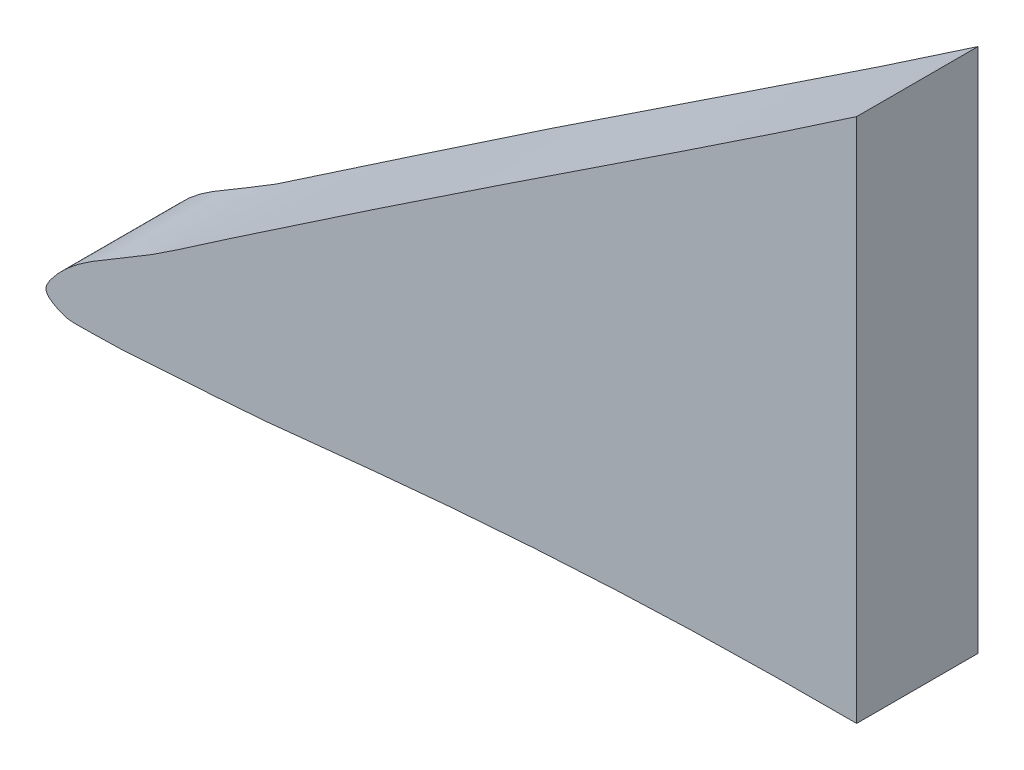
ISO-10303-21;
HEADER;
FILE_DESCRIPTION(('STEP AP214'),'2;1');
FILE_NAME('part.step','',(''),(''),'','','');
FILE_SCHEMA(('AUTOMOTIVE_DESIGN { 1 0 10303 214 1 1 1 1 }'));
ENDSEC;
DATA;
#1=APPLICATION_CONTEXT('core data for automotive mechanical design processes');
#2=APPLICATION_PROTOCOL_DEFINITION('international standard','automotive_design',2000,#1);
#3=PRODUCT_CONTEXT('',#1,'mechanical');
#4=PRODUCT('Part','Part','',(#3));
#5=PRODUCT_RELATED_PRODUCT_CATEGORY('part','',(#4));
#6=PRODUCT_DEFINITION_FORMATION('','',#4);
#7=PRODUCT_DEFINITION_CONTEXT('part definition',#1,'design');
#8=PRODUCT_DEFINITION('design','',#6,#7);
#9=PRODUCT_DEFINITION_SHAPE('','',#8);
#10=(LENGTH_UNIT() NAMED_UNIT(*) SI_UNIT(.MILLI.,.METRE.));
#11=(NAMED_UNIT(*) PLANE_ANGLE_UNIT() SI_UNIT($,.RADIAN.));
#12=(NAMED_UNIT(*) SI_UNIT($,.STERADIAN.) SOLID_ANGLE_UNIT());
#13=UNCERTAINTY_MEASURE_WITH_UNIT(LENGTH_MEASURE(1.E-05),#10,'distance_accuracy_value','');
#14=(GEOMETRIC_REPRESENTATION_CONTEXT(3) GLOBAL_UNCERTAINTY_ASSIGNED_CONTEXT((#13)) GLOBAL_UNIT_ASSIGNED_CONTEXT((#10,
#11,#12)) REPRESENTATION_CONTEXT('',''));
#15=CARTESIAN_POINT('',(0.,0.,0.));
#16=DIRECTION('',(0.,0.,1.));
#17=DIRECTION('',(1.,0.,0.));
#18=AXIS2_PLACEMENT_3D('',#15,#16,#17);
#19=CARTESIAN_POINT('',(-46.714549636511,-86.6609953526798,75.9999999999997));
#20=CARTESIAN_POINT('',(-50.8091947260203,-89.4689143421339,75.9999999999997));
#21=CARTESIAN_POINT('',(-54.9397706813966,-92.2232574132769,75.9999999999997));
#22=CARTESIAN_POINT('',(-63.2198688412411,-97.7036931176967,75.9999999999997));
#23=CARTESIAN_POINT('',(-67.3679142677134,-100.43194382548,75.9999999999997));
#24=CARTESIAN_POINT('',(-73.5732698081573,-104.54945828435,75.9999999999997));
#25=CARTESIAN_POINT('',(-75.6397526068602,-105.924963015026,75.9999999999997));
#26=CARTESIAN_POINT('',(-79.7613454149467,-108.692914657884,75.9999999999997));
#27=CARTESIAN_POINT('',(-81.8146719917252,-110.087996763598,75.9999999999997));
#28=CARTESIAN_POINT('',(-85.9288257974102,-112.867027581635,75.9999999999997));
#29=CARTESIAN_POINT('',(-87.9932562951251,-114.245673064379,75.9999999999997));
#30=CARTESIAN_POINT('',(-91.0597919095647,-116.358148681436,75.9999999999997));
#31=CARTESIAN_POINT('',(-92.0763182018151,-117.070756000452,75.9999999999997));
#32=CARTESIAN_POINT('',(-93.6491628880159,-118.06835023249,75.9999999999997));
#33=CARTESIAN_POINT('',(-94.180860103911,-118.388688735599,75.9999999999997));
#34=CARTESIAN_POINT('',(-95.2506720370473,-119.01881400861,75.9999999999997));
#35=CARTESIAN_POINT('',(-95.7892547549338,-119.327831286199,75.9999999999997));
#36=CARTESIAN_POINT('',(-96.8565030480349,-119.962171727113,75.9999999999997));
#37=CARTESIAN_POINT('',(-97.3865090636973,-120.288220428454,75.9999999999997));
#38=CARTESIAN_POINT('',(-98.1436738417562,-120.829915427262,75.9999999999997));
#39=CARTESIAN_POINT('',(-98.3884907583013,-121.018678751976,75.9999999999997));
#40=CARTESIAN_POINT('',(-98.8550575341822,-121.421182639813,75.9999999999997));
#41=CARTESIAN_POINT('',(-99.0767875291657,-121.634944712253,75.9999999999997));
#42=CARTESIAN_POINT('',(-99.3934502827243,-121.972839407285,75.9999999999997));
#43=CARTESIAN_POINT('',(-99.4957183570229,-122.089029277234,75.9999999999997));
#44=CARTESIAN_POINT('',(-99.6939641465856,-122.328220280304,75.9999999999997));
#45=CARTESIAN_POINT('',(-99.7910298873941,-122.45098983056,75.9999999999997));
#46=CARTESIAN_POINT('',(-99.9253083649858,-122.641798311248,75.9999999999997));
#47=CARTESIAN_POINT('',(-99.968013769193,-122.706690390935,75.9999999999997));
#48=CARTESIAN_POINT('',(-100.046569860655,-122.840776927602,75.9999999999997));
#49=CARTESIAN_POINT('',(-100.083097842919,-122.909888224136,75.9999999999997));
#50=CARTESIAN_POINT('',(-100.140122006398,-123.056744369577,75.9999999999997));
#51=CARTESIAN_POINT('',(-100.160138177325,-123.133794468132,75.9999999999997));
#52=CARTESIAN_POINT('',(-100.161987852299,-123.29092910568,75.9999999999997));
#53=CARTESIAN_POINT('',(-100.140435044257,-123.369170572449,75.9999999999997));
#54=CARTESIAN_POINT('',(-100.062395177802,-123.505420696053,75.9999999999997));
#55=CARTESIAN_POINT('',(-100.008820348166,-123.564815270248,75.9999999999997));
#56=CARTESIAN_POINT('',(-99.8922824191521,-123.671540082887,75.9999999999997));
#57=CARTESIAN_POINT('',(-99.8292266810561,-123.718228121976,75.9999999999997));
#58=CARTESIAN_POINT('',(-99.6343201626261,-123.849121581957,75.9999999999997));
#59=CARTESIAN_POINT('',(-99.4960552759929,-123.925128965519,75.9999999999997));
#60=CARTESIAN_POINT('',(-99.2139737089938,-124.060902500676,75.9999999999997));
#61=CARTESIAN_POINT('',(-99.0693868264005,-124.120309837029,75.9999999999997));
#62=CARTESIAN_POINT('',(-98.7670887219757,-124.207741593188,75.9999999999997));
#63=CARTESIAN_POINT('',(-98.6130239503948,-124.230602735389,75.9999999999997));
#64=CARTESIAN_POINT('',(-98.3053482397128,-124.250237635104,75.9999999999997));
#65=CARTESIAN_POINT('',(-98.1509555919928,-124.248957300662,75.9999999999997));
#66=CARTESIAN_POINT('',(-97.8420881944584,-124.244754303279,75.9999999999997));
#67=CARTESIAN_POINT('',(-97.6876124277774,-124.241742621353,75.9999999999997));
#68=CARTESIAN_POINT('',(-97.2243140594273,-124.235716453161,75.9999999999997));
#69=CARTESIAN_POINT('',(-96.9154266858438,-124.233084491,75.9999999999997));
#70=CARTESIAN_POINT('',(-96.297691573564,-124.225300985494,75.9999999999997));
#71=CARTESIAN_POINT('',(-95.9888400113349,-124.220392503301,75.9999999999997));
#72=CARTESIAN_POINT('',(-95.3712843527358,-124.201201166229,75.9999999999997));
#73=CARTESIAN_POINT('',(-95.062785528776,-124.187038530016,75.9999999999997));
#74=CARTESIAN_POINT('',(-94.1379329625809,-124.134940712054,75.9999999999997));
#75=CARTESIAN_POINT('',(-93.5220756735607,-124.089195249184,75.9999999999997));
#76=CARTESIAN_POINT('',(-92.2901602203143,-124.000815548248,75.9999999999997));
#77=CARTESIAN_POINT('',(-91.6741345066539,-123.957678704573,75.9999999999997));
#78=CARTESIAN_POINT('',(-89.8255753887511,-123.835733199131,75.9999999999997));
#79=CARTESIAN_POINT('',(-88.5924280765921,-123.766432955919,75.9999999999997));
#80=CARTESIAN_POINT('',(-86.128688411435,-123.588260376622,75.9999999999997));
#81=CARTESIAN_POINT('',(-84.8993034093296,-123.471445699291,75.9999999999997));
#82=CARTESIAN_POINT('',(-82.4425984992588,-123.219599691474,75.9999999999997));
#83=CARTESIAN_POINT('',(-81.2150236386884,-123.085859205252,75.9999999999997));
#84=CARTESIAN_POINT('',(-78.7588494721477,-122.828677410794,75.9999999999997));
#85=CARTESIAN_POINT('',(-77.5301369817389,-122.706017845573,75.9999999999997));
#86=CARTESIAN_POINT('',(-73.8423273707464,-122.363542456653,75.9999999999997));
#87=CARTESIAN_POINT('',(-71.3815834647919,-122.166164657517,75.9999999999997));
#88=CARTESIAN_POINT('',(-66.4561014286254,-121.827474641629,75.9999999999997));
#89=CARTESIAN_POINT('',(-63.9911931706759,-121.688550450703,75.9999999999997));
#90=CARTESIAN_POINT('',(-56.5894701797738,-121.370009496748,75.9999999999997));
#91=CARTESIAN_POINT('',(-51.6525358438038,-121.287991644253,75.9999999999997));
#92=CARTESIAN_POINT('',(-46.7145496364993,-121.311724899202,75.9999999999997));
#93=B_SPLINE_CURVE_WITH_KNOTS('',3,(#19,#20,#21,#22,#23,#24,#25,#26,#27,#28,#29,#30,#31,#32,#33,
#34,#35,#36,#37,#38,#39,#40,#41,#42,#43,#44,#45,#46,#47,#48,#49,#50,#51,#52,#53,#54,#55,#56,#57,
#58,#59,#60,#61,#62,#63,#64,#65,#66,#67,#68,#69,#70,#71,#72,#73,#74,#75,#76,#77,#78,#79,#80,#81,
#82,#83,#84,#85,#86,#87,#88,#89,#90,#91,#92),.UNSPECIFIED.,.F.,.F.,(4,2,2,2,2,2,2,2,2,2,2,2,2,2,
2,2,2,2,2,2,2,2,2,2,2,2,2,2,2,2,2,2,2,2,2,2,4),(0.,0.124999999999994,0.249999999999989,
0.312499999999986,0.374999999999983,0.43749999999998,0.468749999999979,0.484374999999978,
0.499999999999977,0.515624999999977,0.523437499999977,0.531249999999976,0.535156249999976,
0.539062499999976,0.541015624999976,0.542968749999976,0.544921874999976,0.546874999999976,
0.548828124999976,0.550781249999976,0.554687499999977,0.558593749999977,0.562499999999977,
0.566406249999978,0.570312499999978,0.578124999999978,0.585937499999979,0.59374999999998,
0.60937499999998,0.624999999999981,0.656249999999983,0.687499999999985,0.718749999999986,
0.749999999999988,0.812499999999991,0.874999999999994,1.),.UNSPECIFIED.);
#94=DIRECTION('',(0.,0.,-1.));
#95=VECTOR('',#94,1.);
#96=SURFACE_OF_LINEAR_EXTRUSION('',#93,#95);
#97=CARTESIAN_POINT('',(-46.714549636511,-86.6609953526798,67.9999999999997));
#98=CARTESIAN_POINT('',(-50.8091947260203,-89.4689143421339,67.9999999999997));
#99=CARTESIAN_POINT('',(-54.9397706813966,-92.2232574132769,67.9999999999997));
#100=CARTESIAN_POINT('',(-63.2198688412411,-97.7036931176967,67.9999999999997));
#101=CARTESIAN_POINT('',(-67.3679142677134,-100.43194382548,67.9999999999997));
#102=CARTESIAN_POINT('',(-73.5732698081573,-104.54945828435,67.9999999999997));
#103=CARTESIAN_POINT('',(-75.6397526068602,-105.924963015026,67.9999999999997));
#104=CARTESIAN_POINT('',(-79.7613454149467,-108.692914657884,67.9999999999997));
#105=CARTESIAN_POINT('',(-81.8146719917252,-110.087996763598,67.9999999999997));
#106=CARTESIAN_POINT('',(-85.9288257974102,-112.867027581635,67.9999999999997));
#107=CARTESIAN_POINT('',(-87.9932562951251,-114.245673064379,67.9999999999997));
#108=CARTESIAN_POINT('',(-91.0597919095647,-116.358148681436,67.9999999999997));
#109=CARTESIAN_POINT('',(-92.0763182018151,-117.070756000452,67.9999999999997));
#110=CARTESIAN_POINT('',(-93.6491628880159,-118.06835023249,67.9999999999997));
#111=CARTESIAN_POINT('',(-94.180860103911,-118.388688735599,67.9999999999997));
#112=CARTESIAN_POINT('',(-95.2506720370473,-119.01881400861,67.9999999999997));
#113=CARTESIAN_POINT('',(-95.7892547549338,-119.327831286199,67.9999999999997));
#114=CARTESIAN_POINT('',(-96.8565030480349,-119.962171727113,67.9999999999997));
#115=CARTESIAN_POINT('',(-97.3865090636973,-120.288220428454,67.9999999999997));
#116=CARTESIAN_POINT('',(-98.1436738417562,-120.829915427262,67.9999999999997));
#117=CARTESIAN_POINT('',(-98.3884907583013,-121.018678751976,67.9999999999997));
#118=CARTESIAN_POINT('',(-98.8550575341822,-121.421182639813,67.9999999999997));
#119=CARTESIAN_POINT('',(-99.0767875291657,-121.634944712253,67.9999999999997));
#120=CARTESIAN_POINT('',(-99.3934502827243,-121.972839407285,67.9999999999997));
#121=CARTESIAN_POINT('',(-99.4957183570229,-122.089029277234,67.9999999999997));
#122=CARTESIAN_POINT('',(-99.6939641465856,-122.328220280304,67.9999999999997));
#123=CARTESIAN_POINT('',(-99.7910298873941,-122.45098983056,67.9999999999997));
#124=CARTESIAN_POINT('',(-99.9253083649858,-122.641798311248,67.9999999999997));
#125=CARTESIAN_POINT('',(-99.968013769193,-122.706690390935,67.9999999999997));
#126=CARTESIAN_POINT('',(-100.046569860655,-122.840776927602,67.9999999999997));
#127=CARTESIAN_POINT('',(-100.083097842919,-122.909888224136,67.9999999999997));
#128=CARTESIAN_POINT('',(-100.140122006398,-123.056744369577,67.9999999999997));
#129=CARTESIAN_POINT('',(-100.160138177325,-123.133794468132,67.9999999999997));
#130=CARTESIAN_POINT('',(-100.161987852299,-123.29092910568,67.9999999999997));
#131=CARTESIAN_POINT('',(-100.140435044257,-123.369170572449,67.9999999999997));
#132=CARTESIAN_POINT('',(-100.062395177802,-123.505420696053,67.9999999999997));
#133=CARTESIAN_POINT('',(-100.008820348166,-123.564815270248,67.9999999999997));
#134=CARTESIAN_POINT('',(-99.8922824191521,-123.671540082887,67.9999999999997));
#135=CARTESIAN_POINT('',(-99.8292266810561,-123.718228121976,67.9999999999997));
#136=CARTESIAN_POINT('',(-99.6343201626261,-123.849121581957,67.9999999999997));
#137=CARTESIAN_POINT('',(-99.4960552759929,-123.925128965519,67.9999999999997));
#138=CARTESIAN_POINT('',(-99.2139737089938,-124.060902500676,67.9999999999997));
#139=CARTESIAN_POINT('',(-99.0693868264005,-124.120309837029,67.9999999999997));
#140=CARTESIAN_POINT('',(-98.7670887219757,-124.207741593188,67.9999999999997));
#141=CARTESIAN_POINT('',(-98.6130239503948,-124.230602735389,67.9999999999997));
#142=CARTESIAN_POINT('',(-98.3053482397128,-124.250237635104,67.9999999999997));
#143=CARTESIAN_POINT('',(-98.1509555919928,-124.248957300662,67.9999999999997));
#144=CARTESIAN_POINT('',(-97.8420881944584,-124.244754303279,67.9999999999997));
#145=CARTESIAN_POINT('',(-97.6876124277774,-124.241742621353,67.9999999999997));
#146=CARTESIAN_POINT('',(-97.2243140594273,-124.235716453161,67.9999999999997));
#147=CARTESIAN_POINT('',(-96.9154266858438,-124.233084491,67.9999999999997));
#148=CARTESIAN_POINT('',(-96.297691573564,-124.225300985494,67.9999999999997));
#149=CARTESIAN_POINT('',(-95.9888400113349,-124.220392503301,67.9999999999997));
#150=CARTESIAN_POINT('',(-95.3712843527358,-124.201201166229,67.9999999999997));
#151=CARTESIAN_POINT('',(-95.062785528776,-124.187038530016,67.9999999999997));
#152=CARTESIAN_POINT('',(-94.1379329625809,-124.134940712054,67.9999999999997));
#153=CARTESIAN_POINT('',(-93.5220756735607,-124.089195249184,67.9999999999997));
#154=CARTESIAN_POINT('',(-92.2901602203143,-124.000815548248,67.9999999999997));
#155=CARTESIAN_POINT('',(-91.6741345066539,-123.957678704573,67.9999999999997));
#156=CARTESIAN_POINT('',(-89.8255753887511,-123.835733199131,67.9999999999997));
#157=CARTESIAN_POINT('',(-88.5924280765921,-123.766432955919,67.9999999999997));
#158=CARTESIAN_POINT('',(-86.128688411435,-123.588260376622,67.9999999999997));
#159=CARTESIAN_POINT('',(-84.8993034093296,-123.471445699291,67.9999999999997));
#160=CARTESIAN_POINT('',(-82.4425984992588,-123.219599691474,67.9999999999997));
#161=CARTESIAN_POINT('',(-81.2150236386884,-123.085859205252,67.9999999999997));
#162=CARTESIAN_POINT('',(-78.7588494721477,-122.828677410794,67.9999999999997));
#163=CARTESIAN_POINT('',(-77.5301369817389,-122.706017845573,67.9999999999997));
#164=CARTESIAN_POINT('',(-73.8423273707464,-122.363542456653,67.9999999999997));
#165=CARTESIAN_POINT('',(-71.3815834647919,-122.166164657517,67.9999999999997));
#166=CARTESIAN_POINT('',(-66.4561014286254,-121.827474641629,67.9999999999997));
#167=CARTESIAN_POINT('',(-63.9911931706759,-121.688550450703,67.9999999999997));
#168=CARTESIAN_POINT('',(-56.5894701797738,-121.370009496748,67.9999999999997));
#169=CARTESIAN_POINT('',(-51.6525358438038,-121.287991644253,67.9999999999997));
#170=CARTESIAN_POINT('',(-46.7145496364993,-121.311724899202,67.9999999999997));
#171=B_SPLINE_CURVE_WITH_KNOTS('',3,(#97,#98,#99,#100,#101,#102,#103,#104,#105,#106,#107,#108,
#109,#110,#111,#112,#113,#114,#115,#116,#117,#118,#119,#120,#121,#122,#123,#124,#125,#126,#127,
#128,#129,#130,#131,#132,#133,#134,#135,#136,#137,#138,#139,#140,#141,#142,#143,#144,#145,#146,
#147,#148,#149,#150,#151,#152,#153,#154,#155,#156,#157,#158,#159,#160,#161,#162,#163,#164,#165,
#166,#167,#168,#169,#170),.UNSPECIFIED.,.F.,.F.,(4,2,2,2,2,2,2,2,2,2,2,2,2,2,2,2,2,2,2,2,2,2,2,
2,2,2,2,2,2,2,2,2,2,2,2,2,4),(0.,0.124999999999994,0.249999999999989,0.312499999999986,
0.374999999999983,0.43749999999998,0.468749999999979,0.484374999999978,0.499999999999977,
0.515624999999977,0.523437499999977,0.531249999999976,0.535156249999976,0.539062499999976,
0.541015624999976,0.542968749999976,0.544921874999976,0.546874999999976,0.548828124999976,
0.550781249999976,0.554687499999977,0.558593749999977,0.562499999999977,0.566406249999978,
0.570312499999978,0.578124999999978,0.585937499999979,0.59374999999998,0.60937499999998,
0.624999999999981,0.656249999999983,0.687499999999985,0.718749999999986,0.749999999999988,
0.812499999999991,0.874999999999994,1.),.UNSPECIFIED.);
#172=CARTESIAN_POINT('',(-46.7145496365005,-86.660995352673,67.9999999999997));
#173=VERTEX_POINT('',#172);
#174=CARTESIAN_POINT('',(-46.7145496364992,-121.311724899202,67.9999999999997));
#175=VERTEX_POINT('',#174);
#176=EDGE_CURVE('E65',#173,#175,#171,.T.);
#177=ORIENTED_EDGE('',*,*,#176,.T.);
#178=DIRECTION('',(0.,0.,-1.));
#179=VECTOR('',#178,1.);
#180=CARTESIAN_POINT('',(-46.7145496364992,-121.311724899202,75.9999999999997));
#181=LINE('',#180,#179);
#182=CARTESIAN_POINT('',(-46.7145496364992,-121.311724899202,75.9999999999997));
#183=VERTEX_POINT('',#182);
#184=EDGE_CURVE('E11',#183,#175,#181,.T.);
#185=ORIENTED_EDGE('',*,*,#184,.F.);
#186=CARTESIAN_POINT('',(-46.7145496364993,-121.311724899202,75.9999999999997));
#187=CARTESIAN_POINT('',(-51.6525358438038,-121.287991644253,75.9999999999997));
#188=CARTESIAN_POINT('',(-56.5894701797738,-121.370009496748,75.9999999999997));
#189=CARTESIAN_POINT('',(-63.9911931706759,-121.688550450703,75.9999999999997));
#190=CARTESIAN_POINT('',(-66.4561014286254,-121.827474641629,75.9999999999997));
#191=CARTESIAN_POINT('',(-71.3815834647919,-122.166164657517,75.9999999999997));
#192=CARTESIAN_POINT('',(-73.8423273707464,-122.363542456653,75.9999999999997));
#193=CARTESIAN_POINT('',(-77.5301369817389,-122.706017845573,75.9999999999997));
#194=CARTESIAN_POINT('',(-78.7588494721477,-122.828677410794,75.9999999999997));
#195=CARTESIAN_POINT('',(-81.2150236386884,-123.085859205252,75.9999999999997));
#196=CARTESIAN_POINT('',(-82.4425984992588,-123.219599691474,75.9999999999997));
#197=CARTESIAN_POINT('',(-84.8993034093296,-123.471445699291,75.9999999999997));
#198=CARTESIAN_POINT('',(-86.128688411435,-123.588260376622,75.9999999999997));
#199=CARTESIAN_POINT('',(-88.5924280765921,-123.766432955919,75.9999999999997));
#200=CARTESIAN_POINT('',(-89.8255753887511,-123.835733199131,75.9999999999997));
#201=CARTESIAN_POINT('',(-91.6741345066539,-123.957678704573,75.9999999999997));
#202=CARTESIAN_POINT('',(-92.2901602203143,-124.000815548248,75.9999999999997));
#203=CARTESIAN_POINT('',(-93.5220756735607,-124.089195249184,75.9999999999997));
#204=CARTESIAN_POINT('',(-94.1379329625809,-124.134940712054,75.9999999999997));
#205=CARTESIAN_POINT('',(-95.062785528776,-124.187038530016,75.9999999999997));
#206=CARTESIAN_POINT('',(-95.3712843527358,-124.201201166229,75.9999999999997));
#207=CARTESIAN_POINT('',(-95.9888400113349,-124.220392503301,75.9999999999997));
#208=CARTESIAN_POINT('',(-96.297691573564,-124.225300985494,75.9999999999997));
#209=CARTESIAN_POINT('',(-96.9154266858438,-124.233084491,75.9999999999997));
#210=CARTESIAN_POINT('',(-97.2243140594273,-124.235716453161,75.9999999999997));
#211=CARTESIAN_POINT('',(-97.6876124277774,-124.241742621353,75.9999999999997));
#212=CARTESIAN_POINT('',(-97.8420881944584,-124.244754303279,75.9999999999997));
#213=CARTESIAN_POINT('',(-98.1509555919928,-124.248957300662,75.9999999999997));
#214=CARTESIAN_POINT('',(-98.3053482397128,-124.250237635104,75.9999999999997));
#215=CARTESIAN_POINT('',(-98.6130239503948,-124.230602735389,75.9999999999997));
#216=CARTESIAN_POINT('',(-98.7670887219757,-124.207741593188,75.9999999999997));
#217=CARTESIAN_POINT('',(-99.0693868264005,-124.120309837029,75.9999999999997));
#218=CARTESIAN_POINT('',(-99.2139737089938,-124.060902500676,75.9999999999997));
#219=CARTESIAN_POINT('',(-99.4960552759929,-123.925128965519,75.9999999999997));
#220=CARTESIAN_POINT('',(-99.6343201626261,-123.849121581957,75.9999999999997));
#221=CARTESIAN_POINT('',(-99.8292266810561,-123.718228121976,75.9999999999997));
#222=CARTESIAN_POINT('',(-99.8922824191521,-123.671540082887,75.9999999999997));
#223=CARTESIAN_POINT('',(-100.008820348166,-123.564815270248,75.9999999999997));
#224=CARTESIAN_POINT('',(-100.062395177802,-123.505420696053,75.9999999999997));
#225=CARTESIAN_POINT('',(-100.140435044257,-123.369170572449,75.9999999999997));
#226=CARTESIAN_POINT('',(-100.161987852299,-123.29092910568,75.9999999999997));
#227=CARTESIAN_POINT('',(-100.160138177325,-123.133794468132,75.9999999999997));
#228=CARTESIAN_POINT('',(-100.140122006398,-123.056744369577,75.9999999999997));
#229=CARTESIAN_POINT('',(-100.083097842919,-122.909888224136,75.9999999999997));
#230=CARTESIAN_POINT('',(-100.046569860655,-122.840776927602,75.9999999999997));
#231=CARTESIAN_POINT('',(-99.968013769193,-122.706690390935,75.9999999999997));
#232=CARTESIAN_POINT('',(-99.9253083649858,-122.641798311248,75.9999999999997));
#233=CARTESIAN_POINT('',(-99.7910298873941,-122.45098983056,75.9999999999997));
#234=CARTESIAN_POINT('',(-99.6939641465856,-122.328220280304,75.9999999999997));
#235=CARTESIAN_POINT('',(-99.4957183570229,-122.089029277234,75.9999999999997));
#236=CARTESIAN_POINT('',(-99.3934502827243,-121.972839407285,75.9999999999997));
#237=CARTESIAN_POINT('',(-99.0767875291657,-121.634944712253,75.9999999999997));
#238=CARTESIAN_POINT('',(-98.8550575341822,-121.421182639813,75.9999999999997));
#239=CARTESIAN_POINT('',(-98.3884907583013,-121.018678751976,75.9999999999997));
#240=CARTESIAN_POINT('',(-98.1436738417562,-120.829915427262,75.9999999999997));
#241=CARTESIAN_POINT('',(-97.3865090636973,-120.288220428454,75.9999999999997));
#242=CARTESIAN_POINT('',(-96.8565030480349,-119.962171727113,75.9999999999997));
#243=CARTESIAN_POINT('',(-95.7892547549338,-119.327831286199,75.9999999999997));
#244=CARTESIAN_POINT('',(-95.2506720370473,-119.01881400861,75.9999999999997));
#245=CARTESIAN_POINT('',(-94.180860103911,-118.388688735599,75.9999999999997));
#246=CARTESIAN_POINT('',(-93.6491628880159,-118.06835023249,75.9999999999997));
#247=CARTESIAN_POINT('',(-92.0763182018151,-117.070756000452,75.9999999999997));
#248=CARTESIAN_POINT('',(-91.0597919095647,-116.358148681436,75.9999999999997));
#249=CARTESIAN_POINT('',(-87.9932562951251,-114.245673064379,75.9999999999997));
#250=CARTESIAN_POINT('',(-85.9288257974102,-112.867027581635,75.9999999999997));
#251=CARTESIAN_POINT('',(-81.8146719917252,-110.087996763598,75.9999999999997));
#252=CARTESIAN_POINT('',(-79.7613454149467,-108.692914657884,75.9999999999997));
#253=CARTESIAN_POINT('',(-75.6397526068602,-105.924963015026,75.9999999999997));
#254=CARTESIAN_POINT('',(-73.5732698081573,-104.54945828435,75.9999999999997));
#255=CARTESIAN_POINT('',(-67.3679142677134,-100.43194382548,75.9999999999997));
#256=CARTESIAN_POINT('',(-63.2198688412411,-97.7036931176967,75.9999999999997));
#257=CARTESIAN_POINT('',(-54.9397706813966,-92.2232574132769,75.9999999999997));
#258=CARTESIAN_POINT('',(-50.8091947260203,-89.4689143421339,75.9999999999997));
#259=CARTESIAN_POINT('',(-46.714549636511,-86.6609953526798,75.9999999999997));
#260=B_SPLINE_CURVE_WITH_KNOTS('',3,(#186,#187,#188,#189,#190,#191,#192,#193,#194,#195,#196,
#197,#198,#199,#200,#201,#202,#203,#204,#205,#206,#207,#208,#209,#210,#211,#212,#213,#214,#215,
#216,#217,#218,#219,#220,#221,#222,#223,#224,#225,#226,#227,#228,#229,#230,#231,#232,#233,#234,
#235,#236,#237,#238,#239,#240,#241,#242,#243,#244,#245,#246,#247,#248,#249,#250,#251,#252,#253,
#254,#255,#256,#257,#258,#259),.UNSPECIFIED.,.F.,.F.,(4,2,2,2,2,2,2,2,2,2,2,2,2,2,2,2,2,2,2,2,2,
2,2,2,2,2,2,2,2,2,2,2,2,2,2,2,4),(0.,0.125000000000006,0.187500000000009,0.250000000000012,
0.281250000000014,0.312500000000015,0.343750000000017,0.375000000000019,0.39062500000002,
0.40625000000002,0.414062500000021,0.421875000000022,0.429687500000022,0.433593750000022,
0.437500000000023,0.441406250000023,0.445312500000023,0.449218750000024,0.451171875000024,
0.453125000000024,0.455078125000024,0.457031250000024,0.458984375000024,0.460937500000024,
0.464843750000024,0.468750000000024,0.476562500000023,0.484375000000023,0.500000000000023,
0.515625000000022,0.531250000000021,0.56250000000002,0.625000000000017,0.687500000000014,
0.750000000000011,0.875000000000006,1.),.UNSPECIFIED.);
#261=CARTESIAN_POINT('',(-46.7145496365005,-86.660995352673,75.9999999999997));
#262=VERTEX_POINT('',#261);
#263=EDGE_CURVE('E64',#262,#183,#260,.F.);
#264=ORIENTED_EDGE('',*,*,#263,.F.);
#265=DIRECTION('',(0.,0.,-1.));
#266=VECTOR('',#265,1.);
#267=CARTESIAN_POINT('',(-46.7145496365005,-86.660995352673,75.9999999999997));
#268=LINE('',#267,#266);
#269=EDGE_CURVE('E41',#262,#173,#268,.T.);
#270=ORIENTED_EDGE('',*,*,#269,.T.);
#271=EDGE_LOOP('',(#177,#185,#264,#270));
#272=FACE_BOUND('',#271,.T.);
#273=ADVANCED_FACE('F30',(#272),#96,.F.);
#274=CARTESIAN_POINT('',(-46.7145496365005,-86.660995352673,75.9999999999997));
#275=DIRECTION('',(-1.,0.,0.));
#276=DIRECTION('',(0.,-1.,0.));
#277=AXIS2_PLACEMENT_3D('',#274,#275,#276);
#278=PLANE('',#277);
#279=DIRECTION('',(0.,1.,0.));
#280=VECTOR('',#279,1.);
#281=CARTESIAN_POINT('',(-46.7145496365005,-86.660995352673,67.9999999999997));
#282=LINE('',#281,#280);
#283=EDGE_CURVE('E57',#175,#173,#282,.T.);
#284=ORIENTED_EDGE('',*,*,#283,.T.);
#285=ORIENTED_EDGE('',*,*,#269,.F.);
#286=DIRECTION('',(0.,1.,0.));
#287=VECTOR('',#286,1.);
#288=CARTESIAN_POINT('',(-46.7145496365005,-86.660995352673,75.9999999999997));
#289=LINE('',#288,#287);
#290=EDGE_CURVE('E49',#183,#262,#289,.T.);
#291=ORIENTED_EDGE('',*,*,#290,.F.);
#292=ORIENTED_EDGE('',*,*,#184,.T.);
#293=EDGE_LOOP('',(#284,#285,#291,#292));
#294=FACE_BOUND('',#293,.T.);
#295=ADVANCED_FACE('F60',(#294),#278,.F.);
#296=CARTESIAN_POINT('',(-96.3228789014866,-119.645001506658,75.9999999999997));
#297=DIRECTION('',(0.,0.,-1.));
#298=DIRECTION('',(-1.,0.,0.));
#299=AXIS2_PLACEMENT_3D('',#296,#297,#298);
#300=PLANE('',#299);
#301=ORIENTED_EDGE('',*,*,#263,.T.);
#302=ORIENTED_EDGE('',*,*,#290,.T.);
#303=EDGE_LOOP('',(#301,#302));
#304=FACE_BOUND('',#303,.T.);
#305=ADVANCED_FACE('F87',(#304),#300,.F.);
#306=CARTESIAN_POINT('',(-96.3228789014866,-119.645001506658,67.9999999999997));
#307=DIRECTION('',(0.,0.,-1.));
#308=DIRECTION('',(-1.,0.,0.));
#309=AXIS2_PLACEMENT_3D('',#306,#307,#308);
#310=PLANE('',#309);
#311=ORIENTED_EDGE('',*,*,#176,.F.);
#312=ORIENTED_EDGE('',*,*,#283,.F.);
#313=EDGE_LOOP('',(#311,#312));
#314=FACE_BOUND('',#313,.T.);
#315=ADVANCED_FACE('F71',(#314),#310,.T.);
#316=CLOSED_SHELL('',(#273,#295,#305,#315));
#317=MANIFOLD_SOLID_BREP('B2',#316);
#318=ADVANCED_BREP_SHAPE_REPRESENTATION('',(#18,#317),#14);
#319=SHAPE_DEFINITION_REPRESENTATION(#9,#318);
ENDSEC;
END-ISO-10303-21;
